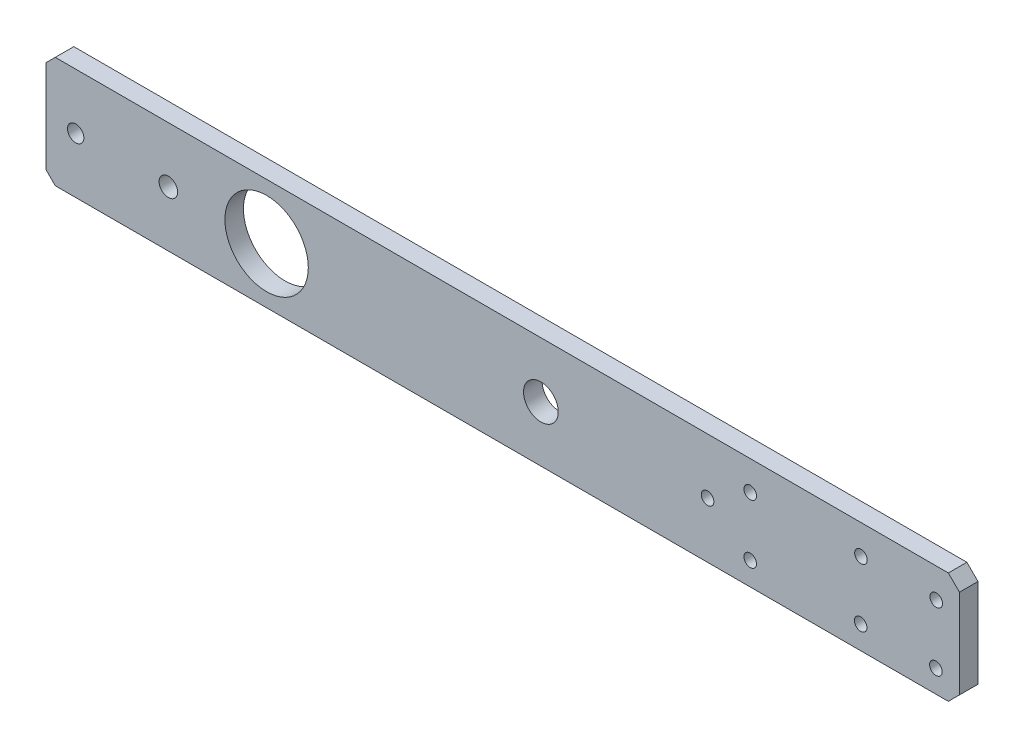
ISO-10303-21;
HEADER;
FILE_DESCRIPTION(('STEP AP214'),'2;1');
FILE_NAME('part.step','',(''),(''),'','','');
FILE_SCHEMA(('AUTOMOTIVE_DESIGN { 1 0 10303 214 1 1 1 1 }'));
ENDSEC;
DATA;
#1=APPLICATION_CONTEXT('core data for automotive mechanical design processes');
#2=APPLICATION_PROTOCOL_DEFINITION('international standard','automotive_design',2000,#1);
#3=PRODUCT_CONTEXT('',#1,'mechanical');
#4=PRODUCT('Part','Part','',(#3));
#5=PRODUCT_RELATED_PRODUCT_CATEGORY('part','',(#4));
#6=PRODUCT_DEFINITION_FORMATION('','',#4);
#7=PRODUCT_DEFINITION_CONTEXT('part definition',#1,'design');
#8=PRODUCT_DEFINITION('design','',#6,#7);
#9=PRODUCT_DEFINITION_SHAPE('','',#8);
#10=(LENGTH_UNIT() NAMED_UNIT(*) SI_UNIT(.MILLI.,.METRE.));
#11=(NAMED_UNIT(*) PLANE_ANGLE_UNIT() SI_UNIT($,.RADIAN.));
#12=(NAMED_UNIT(*) SI_UNIT($,.STERADIAN.) SOLID_ANGLE_UNIT());
#13=UNCERTAINTY_MEASURE_WITH_UNIT(LENGTH_MEASURE(1.E-05),#10,'distance_accuracy_value','');
#14=(GEOMETRIC_REPRESENTATION_CONTEXT(3) GLOBAL_UNCERTAINTY_ASSIGNED_CONTEXT((#13)) GLOBAL_UNIT_ASSIGNED_CONTEXT((#10,
#11,#12)) REPRESENTATION_CONTEXT('',''));
#15=CARTESIAN_POINT('',(0.,0.,0.));
#16=DIRECTION('',(0.,0.,1.));
#17=DIRECTION('',(1.,0.,0.));
#18=AXIS2_PLACEMENT_3D('',#15,#16,#17);
#19=CARTESIAN_POINT('',(0.,0.,3.175));
#20=DIRECTION('',(0.,0.,-1.));
#21=DIRECTION('',(-1.,0.,0.));
#22=AXIS2_PLACEMENT_3D('',#19,#20,#21);
#23=PLANE('',#22);
#24=CARTESIAN_POINT('',(0.,0.,3.175));
#25=DIRECTION('',(0.,0.,1.));
#26=DIRECTION('',(1.,0.,0.));
#27=AXIS2_PLACEMENT_3D('',#24,#25,#26);
#28=CIRCLE('',#27,14.2875);
#29=CARTESIAN_POINT('',(14.2875,0.,3.175));
#30=VERTEX_POINT('',#29);
#31=EDGE_CURVE('E112',#30,#30,#28,.T.);
#32=ORIENTED_EDGE('',*,*,#31,.F.);
#33=EDGE_LOOP('',(#32));
#34=FACE_BOUND('',#33,.T.);
#35=DIRECTION('',(0.,-1.,0.));
#36=VECTOR('',#35,1.);
#37=CARTESIAN_POINT('',(-75.5649999999997,-19.05,3.175));
#38=LINE('',#37,#36);
#39=CARTESIAN_POINT('',(-75.5649999999997,15.875,3.175));
#40=VERTEX_POINT('',#39);
#41=CARTESIAN_POINT('',(-75.5649999999997,-15.875,3.175));
#42=VERTEX_POINT('',#41);
#43=EDGE_CURVE('E190',#40,#42,#38,.T.);
#44=ORIENTED_EDGE('',*,*,#43,.T.);
#45=DIRECTION('',(0.707106781186548,-0.707106781186548,0.));
#46=VECTOR('',#45,1.);
#47=CARTESIAN_POINT('',(-75.5649999999997,-15.875,3.175));
#48=LINE('',#47,#46);
#49=CARTESIAN_POINT('',(-72.3899999999997,-19.05,3.175));
#50=VERTEX_POINT('',#49);
#51=EDGE_CURVE('E153',#42,#50,#48,.T.);
#52=ORIENTED_EDGE('',*,*,#51,.T.);
#53=DIRECTION('',(1.,0.,0.));
#54=VECTOR('',#53,1.);
#55=CARTESIAN_POINT('',(-28.5749999999997,-19.05,3.175));
#56=LINE('',#55,#54);
#57=CARTESIAN_POINT('',(233.542085197356,-19.05,3.175));
#58=VERTEX_POINT('',#57);
#59=EDGE_CURVE('E131',#50,#58,#56,.T.);
#60=ORIENTED_EDGE('',*,*,#59,.T.);
#61=DIRECTION('',(-0.707106781186548,-0.707106781186547,0.));
#62=VECTOR('',#61,1.);
#63=CARTESIAN_POINT('',(233.542085197356,-19.05,3.175));
#64=LINE('',#63,#62);
#65=CARTESIAN_POINT('',(237.352085197356,-15.24,3.175));
#66=VERTEX_POINT('',#65);
#67=EDGE_CURVE('E127',#58,#66,#64,.F.);
#68=ORIENTED_EDGE('',*,*,#67,.T.);
#69=DIRECTION('',(0.,-1.,0.));
#70=VECTOR('',#69,1.);
#71=CARTESIAN_POINT('',(237.352085197356,19.0500000000001,3.175));
#72=LINE('',#71,#70);
#73=CARTESIAN_POINT('',(237.352085197356,15.24,3.175));
#74=VERTEX_POINT('',#73);
#75=EDGE_CURVE('E200',#74,#66,#72,.T.);
#76=ORIENTED_EDGE('',*,*,#75,.F.);
#77=DIRECTION('',(0.707106781186547,-0.707106781186548,0.));
#78=VECTOR('',#77,1.);
#79=CARTESIAN_POINT('',(237.352085197356,15.24,3.175));
#80=LINE('',#79,#78);
#81=CARTESIAN_POINT('',(233.542085197356,19.0500000000001,3.175));
#82=VERTEX_POINT('',#81);
#83=EDGE_CURVE('E137',#74,#82,#80,.F.);
#84=ORIENTED_EDGE('',*,*,#83,.T.);
#85=DIRECTION('',(-1.,0.,0.));
#86=VECTOR('',#85,1.);
#87=CARTESIAN_POINT('',(0.,19.05,3.175));
#88=LINE('',#87,#86);
#89=CARTESIAN_POINT('',(-72.3899999999997,19.05,3.175));
#90=VERTEX_POINT('',#89);
#91=EDGE_CURVE('E128',#82,#90,#88,.T.);
#92=ORIENTED_EDGE('',*,*,#91,.T.);
#93=DIRECTION('',(-0.707106781186544,-0.707106781186551,0.));
#94=VECTOR('',#93,1.);
#95=CARTESIAN_POINT('',(-72.3899999999997,19.05,3.175));
#96=LINE('',#95,#94);
#97=EDGE_CURVE('E151',#90,#40,#96,.T.);
#98=ORIENTED_EDGE('',*,*,#97,.T.);
#99=EDGE_LOOP('',(#44,#52,#60,#68,#76,#84,#92,#98));
#100=FACE_BOUND('',#99,.T.);
#101=CARTESIAN_POINT('',(151.067159691472,0.,3.175));
#102=DIRECTION('',(0.,0.,1.));
#103=DIRECTION('',(1.,0.,0.));
#104=AXIS2_PLACEMENT_3D('',#101,#102,#103);
#105=CIRCLE('',#104,2.15265000000001);
#106=CARTESIAN_POINT('',(153.219809691472,0.,3.175));
#107=VERTEX_POINT('',#106);
#108=EDGE_CURVE('E235',#107,#107,#105,.T.);
#109=ORIENTED_EDGE('',*,*,#108,.F.);
#110=EDGE_LOOP('',(#109));
#111=FACE_BOUND('',#110,.T.);
#112=CARTESIAN_POINT('',(165.672159691472,-11.1439269688226,3.175));
#113=DIRECTION('',(0.,0.,1.));
#114=DIRECTION('',(1.,0.,0.));
#115=AXIS2_PLACEMENT_3D('',#112,#113,#114);
#116=CIRCLE('',#115,2.15265000000001);
#117=CARTESIAN_POINT('',(167.824809691472,-11.1439269688226,3.175));
#118=VERTEX_POINT('',#117);
#119=EDGE_CURVE('E232',#118,#118,#116,.T.);
#120=ORIENTED_EDGE('',*,*,#119,.F.);
#121=EDGE_LOOP('',(#120));
#122=FACE_BOUND('',#121,.T.);
#123=CARTESIAN_POINT('',(165.672159691472,8.99137535087546,3.175));
#124=DIRECTION('',(0.,0.,1.));
#125=DIRECTION('',(1.,0.,0.));
#126=AXIS2_PLACEMENT_3D('',#123,#124,#125);
#127=CIRCLE('',#126,2.15265000000001);
#128=CARTESIAN_POINT('',(167.824809691472,8.99137535087546,3.175));
#129=VERTEX_POINT('',#128);
#130=EDGE_CURVE('E229',#129,#129,#127,.T.);
#131=ORIENTED_EDGE('',*,*,#130,.F.);
#132=EDGE_LOOP('',(#131));
#133=FACE_BOUND('',#132,.T.);
#134=CARTESIAN_POINT('',(203.608782335042,8.99137535087546,3.175));
#135=DIRECTION('',(0.,0.,1.));
#136=DIRECTION('',(1.,0.,0.));
#137=AXIS2_PLACEMENT_3D('',#134,#135,#136);
#138=CIRCLE('',#137,2.15265000000001);
#139=CARTESIAN_POINT('',(205.761432335042,8.99137535087546,3.175));
#140=VERTEX_POINT('',#139);
#141=EDGE_CURVE('E223',#140,#140,#138,.T.);
#142=ORIENTED_EDGE('',*,*,#141,.F.);
#143=EDGE_LOOP('',(#142));
#144=FACE_BOUND('',#143,.T.);
#145=CARTESIAN_POINT('',(203.503161764145,-11.1439269688226,3.175));
#146=DIRECTION('',(0.,0.,1.));
#147=DIRECTION('',(1.,0.,0.));
#148=AXIS2_PLACEMENT_3D('',#145,#146,#147);
#149=CIRCLE('',#148,2.15265000000001);
#150=CARTESIAN_POINT('',(205.655811764145,-11.1439269688226,3.175));
#151=VERTEX_POINT('',#150);
#152=EDGE_CURVE('E217',#151,#151,#149,.T.);
#153=ORIENTED_EDGE('',*,*,#152,.F.);
#154=EDGE_LOOP('',(#153));
#155=FACE_BOUND('',#154,.T.);
#156=CARTESIAN_POINT('',(229.282371238552,-11.3467989682312,3.175));
#157=DIRECTION('',(0.,0.,1.));
#158=DIRECTION('',(1.,0.,0.));
#159=AXIS2_PLACEMENT_3D('',#156,#157,#158);
#160=CIRCLE('',#159,2.15265000000001);
#161=CARTESIAN_POINT('',(231.435021238552,-11.3467989682312,3.175));
#162=VERTEX_POINT('',#161);
#163=EDGE_CURVE('E211',#162,#162,#160,.T.);
#164=ORIENTED_EDGE('',*,*,#163,.F.);
#165=EDGE_LOOP('',(#164));
#166=FACE_BOUND('',#165,.T.);
#167=CARTESIAN_POINT('',(229.388701470581,8.92379178362501,3.175));
#168=DIRECTION('',(0.,0.,1.));
#169=DIRECTION('',(1.,0.,0.));
#170=AXIS2_PLACEMENT_3D('',#167,#168,#169);
#171=CIRCLE('',#170,2.15265000000001);
#172=CARTESIAN_POINT('',(231.541351470581,8.92379178362501,3.175));
#173=VERTEX_POINT('',#172);
#174=EDGE_CURVE('E203',#173,#173,#171,.T.);
#175=ORIENTED_EDGE('',*,*,#174,.F.);
#176=EDGE_LOOP('',(#175));
#177=FACE_BOUND('',#176,.T.);
#178=CARTESIAN_POINT('',(-33.6549999999997,0.,3.175));
#179=DIRECTION('',(0.,0.,1.));
#180=DIRECTION('',(1.,0.,0.));
#181=AXIS2_PLACEMENT_3D('',#178,#179,#180);
#182=CIRCLE('',#181,3.175);
#183=CARTESIAN_POINT('',(-30.4799999999997,0.,3.175));
#184=VERTEX_POINT('',#183);
#185=EDGE_CURVE('E195',#184,#184,#182,.T.);
#186=ORIENTED_EDGE('',*,*,#185,.F.);
#187=EDGE_LOOP('',(#186));
#188=FACE_BOUND('',#187,.T.);
#189=CARTESIAN_POINT('',(93.9672182120003,0.,3.175));
#190=DIRECTION('',(0.,0.,-1.));
#191=DIRECTION('',(-1.,0.,0.));
#192=AXIS2_PLACEMENT_3D('',#189,#190,#191);
#193=CIRCLE('',#192,5.953125);
#194=CARTESIAN_POINT('',(88.0140932120003,0.,3.175));
#195=VERTEX_POINT('',#194);
#196=EDGE_CURVE('E455',#195,#195,#193,.T.);
#197=ORIENTED_EDGE('',*,*,#196,.T.);
#198=EDGE_LOOP('',(#197));
#199=FACE_BOUND('',#198,.T.);
#200=CARTESIAN_POINT('',(-65.4049999999997,0.,3.175));
#201=DIRECTION('',(0.,0.,-1.));
#202=DIRECTION('',(-1.,0.,0.));
#203=AXIS2_PLACEMENT_3D('',#200,#201,#202);
#204=CIRCLE('',#203,2.80669999999999);
#205=CARTESIAN_POINT('',(-68.2116999999997,0.,3.175));
#206=VERTEX_POINT('',#205);
#207=EDGE_CURVE('E12',#206,#206,#204,.T.);
#208=ORIENTED_EDGE('',*,*,#207,.T.);
#209=EDGE_LOOP('',(#208));
#210=FACE_BOUND('',#209,.T.);
#211=ADVANCED_FACE('F39',(#34,#100,#111,#122,#133,#144,#155,#166,#177,#188,#199,#210),#23,.F.);
#212=CARTESIAN_POINT('',(0.,0.,-3.175));
#213=DIRECTION('',(0.,0.,-1.));
#214=DIRECTION('',(-1.,0.,0.));
#215=AXIS2_PLACEMENT_3D('',#212,#213,#214);
#216=PLANE('',#215);
#217=CARTESIAN_POINT('',(165.672159691472,-11.1439269688226,-3.175));
#218=DIRECTION('',(0.,0.,-1.));
#219=DIRECTION('',(-1.,0.,0.));
#220=AXIS2_PLACEMENT_3D('',#217,#218,#219);
#221=CIRCLE('',#220,2.15265000000001);
#222=CARTESIAN_POINT('',(163.519509691472,-11.1439269688226,-3.175));
#223=VERTEX_POINT('',#222);
#224=EDGE_CURVE('E47',#223,#223,#221,.T.);
#225=ORIENTED_EDGE('',*,*,#224,.F.);
#226=EDGE_LOOP('',(#225));
#227=FACE_BOUND('',#226,.T.);
#228=CARTESIAN_POINT('',(165.672159691472,8.99137535087546,-3.175));
#229=DIRECTION('',(0.,0.,-1.));
#230=DIRECTION('',(-1.,0.,0.));
#231=AXIS2_PLACEMENT_3D('',#228,#229,#230);
#232=CIRCLE('',#231,2.15265000000001);
#233=CARTESIAN_POINT('',(163.519509691472,8.99137535087546,-3.175));
#234=VERTEX_POINT('',#233);
#235=EDGE_CURVE('E165',#234,#234,#232,.T.);
#236=ORIENTED_EDGE('',*,*,#235,.F.);
#237=EDGE_LOOP('',(#236));
#238=FACE_BOUND('',#237,.T.);
#239=CARTESIAN_POINT('',(151.067159691472,0.,-3.175));
#240=DIRECTION('',(0.,0.,-1.));
#241=DIRECTION('',(-1.,0.,0.));
#242=AXIS2_PLACEMENT_3D('',#239,#240,#241);
#243=CIRCLE('',#242,2.15265000000001);
#244=CARTESIAN_POINT('',(148.914509691472,0.,-3.175));
#245=VERTEX_POINT('',#244);
#246=EDGE_CURVE('E162',#245,#245,#243,.T.);
#247=ORIENTED_EDGE('',*,*,#246,.F.);
#248=EDGE_LOOP('',(#247));
#249=FACE_BOUND('',#248,.T.);
#250=CARTESIAN_POINT('',(93.9672182120003,0.,-3.175));
#251=DIRECTION('',(0.,0.,-1.));
#252=DIRECTION('',(-1.,0.,0.));
#253=AXIS2_PLACEMENT_3D('',#250,#251,#252);
#254=CIRCLE('',#253,5.95312499999999);
#255=CARTESIAN_POINT('',(88.0140932120003,0.,-3.175));
#256=VERTEX_POINT('',#255);
#257=EDGE_CURVE('E181',#256,#256,#254,.T.);
#258=ORIENTED_EDGE('',*,*,#257,.F.);
#259=EDGE_LOOP('',(#258));
#260=FACE_BOUND('',#259,.T.);
#261=CARTESIAN_POINT('',(-33.6549999999997,0.,-3.175));
#262=DIRECTION('',(0.,0.,1.));
#263=DIRECTION('',(1.,0.,0.));
#264=AXIS2_PLACEMENT_3D('',#261,#262,#263);
#265=CIRCLE('',#264,3.175);
#266=CARTESIAN_POINT('',(-30.4799999999997,0.,-3.175));
#267=VERTEX_POINT('',#266);
#268=EDGE_CURVE('E185',#267,#267,#265,.T.);
#269=ORIENTED_EDGE('',*,*,#268,.T.);
#270=EDGE_LOOP('',(#269));
#271=FACE_BOUND('',#270,.T.);
#272=CARTESIAN_POINT('',(-65.4049999999997,0.,-3.175));
#273=DIRECTION('',(0.,0.,1.));
#274=DIRECTION('',(1.,0.,0.));
#275=AXIS2_PLACEMENT_3D('',#272,#273,#274);
#276=CIRCLE('',#275,2.8067);
#277=CARTESIAN_POINT('',(-62.5982999999997,0.,-3.175));
#278=VERTEX_POINT('',#277);
#279=EDGE_CURVE('E188',#278,#278,#276,.T.);
#280=ORIENTED_EDGE('',*,*,#279,.T.);
#281=EDGE_LOOP('',(#280));
#282=FACE_BOUND('',#281,.T.);
#283=DIRECTION('',(1.,0.,0.));
#284=VECTOR('',#283,1.);
#285=CARTESIAN_POINT('',(0.,-19.05,-3.175));
#286=LINE('',#285,#284);
#287=CARTESIAN_POINT('',(-72.3899999999997,-19.05,-3.175));
#288=VERTEX_POINT('',#287);
#289=CARTESIAN_POINT('',(233.542085197356,-19.05,-3.175));
#290=VERTEX_POINT('',#289);
#291=EDGE_CURVE('E105',#288,#290,#286,.T.);
#292=ORIENTED_EDGE('',*,*,#291,.F.);
#293=DIRECTION('',(-0.707106781186548,0.707106781186548,0.));
#294=VECTOR('',#293,1.);
#295=CARTESIAN_POINT('',(-45.7199999999998,-45.7199999999998,-3.175));
#296=LINE('',#295,#294);
#297=CARTESIAN_POINT('',(-75.5649999999997,-15.875,-3.175));
#298=VERTEX_POINT('',#297);
#299=EDGE_CURVE('E157',#288,#298,#296,.T.);
#300=ORIENTED_EDGE('',*,*,#299,.T.);
#301=DIRECTION('',(0.,-1.,0.));
#302=VECTOR('',#301,1.);
#303=CARTESIAN_POINT('',(-75.5649999999997,-19.05,-3.175));
#304=LINE('',#303,#302);
#305=CARTESIAN_POINT('',(-75.5649999999997,15.875,-3.175));
#306=VERTEX_POINT('',#305);
#307=EDGE_CURVE('E193',#306,#298,#304,.T.);
#308=ORIENTED_EDGE('',*,*,#307,.F.);
#309=DIRECTION('',(0.707106781186544,0.707106781186551,0.));
#310=VECTOR('',#309,1.);
#311=CARTESIAN_POINT('',(-45.7200000000001,45.7199999999997,-3.175));
#312=LINE('',#311,#310);
#313=CARTESIAN_POINT('',(-72.3899999999997,19.05,-3.175));
#314=VERTEX_POINT('',#313);
#315=EDGE_CURVE('E54',#306,#314,#312,.T.);
#316=ORIENTED_EDGE('',*,*,#315,.T.);
#317=DIRECTION('',(-1.,0.,0.));
#318=VECTOR('',#317,1.);
#319=CARTESIAN_POINT('',(0.,19.05,-3.175));
#320=LINE('',#319,#318);
#321=CARTESIAN_POINT('',(233.542085197356,19.0500000000001,-3.175));
#322=VERTEX_POINT('',#321);
#323=EDGE_CURVE('E111',#322,#314,#320,.T.);
#324=ORIENTED_EDGE('',*,*,#323,.F.);
#325=DIRECTION('',(-0.707106781186547,0.707106781186548,0.));
#326=VECTOR('',#325,1.);
#327=CARTESIAN_POINT('',(126.296042598678,126.296042598678,-3.175));
#328=LINE('',#327,#326);
#329=CARTESIAN_POINT('',(237.352085197356,15.24,-3.175));
#330=VERTEX_POINT('',#329);
#331=EDGE_CURVE('E123',#322,#330,#328,.F.);
#332=ORIENTED_EDGE('',*,*,#331,.T.);
#333=DIRECTION('',(0.,-1.,0.));
#334=VECTOR('',#333,1.);
#335=CARTESIAN_POINT('',(237.352085197356,19.0500000000001,-3.175));
#336=LINE('',#335,#334);
#337=CARTESIAN_POINT('',(237.352085197356,-15.24,-3.175));
#338=VERTEX_POINT('',#337);
#339=EDGE_CURVE('E120',#330,#338,#336,.T.);
#340=ORIENTED_EDGE('',*,*,#339,.T.);
#341=DIRECTION('',(0.707106781186548,0.707106781186547,0.));
#342=VECTOR('',#341,1.);
#343=CARTESIAN_POINT('',(126.296042598678,-126.296042598678,-3.175));
#344=LINE('',#343,#342);
#345=EDGE_CURVE('E116',#338,#290,#344,.F.);
#346=ORIENTED_EDGE('',*,*,#345,.T.);
#347=EDGE_LOOP('',(#292,#300,#308,#316,#324,#332,#340,#346));
#348=FACE_BOUND('',#347,.T.);
#349=CARTESIAN_POINT('',(229.388701470581,8.92379178362501,-3.175));
#350=DIRECTION('',(0.,0.,1.));
#351=DIRECTION('',(1.,0.,0.));
#352=AXIS2_PLACEMENT_3D('',#349,#350,#351);
#353=CIRCLE('',#352,2.15265000000001);
#354=CARTESIAN_POINT('',(231.541351470581,8.92379178362501,-3.175));
#355=VERTEX_POINT('',#354);
#356=EDGE_CURVE('E208',#355,#355,#353,.T.);
#357=ORIENTED_EDGE('',*,*,#356,.T.);
#358=EDGE_LOOP('',(#357));
#359=FACE_BOUND('',#358,.T.);
#360=CARTESIAN_POINT('',(229.282371238552,-11.3467989682312,-3.175));
#361=DIRECTION('',(0.,0.,1.));
#362=DIRECTION('',(1.,0.,0.));
#363=AXIS2_PLACEMENT_3D('',#360,#361,#362);
#364=CIRCLE('',#363,2.15265000000001);
#365=CARTESIAN_POINT('',(231.435021238552,-11.3467989682312,-3.175));
#366=VERTEX_POINT('',#365);
#367=EDGE_CURVE('E214',#366,#366,#364,.T.);
#368=ORIENTED_EDGE('',*,*,#367,.T.);
#369=EDGE_LOOP('',(#368));
#370=FACE_BOUND('',#369,.T.);
#371=CARTESIAN_POINT('',(203.503161764145,-11.1439269688226,-3.175));
#372=DIRECTION('',(0.,0.,1.));
#373=DIRECTION('',(1.,0.,0.));
#374=AXIS2_PLACEMENT_3D('',#371,#372,#373);
#375=CIRCLE('',#374,2.15265000000001);
#376=CARTESIAN_POINT('',(205.655811764145,-11.1439269688226,-3.175));
#377=VERTEX_POINT('',#376);
#378=EDGE_CURVE('E220',#377,#377,#375,.T.);
#379=ORIENTED_EDGE('',*,*,#378,.T.);
#380=EDGE_LOOP('',(#379));
#381=FACE_BOUND('',#380,.T.);
#382=CARTESIAN_POINT('',(203.608782335042,8.99137535087546,-3.175));
#383=DIRECTION('',(0.,0.,1.));
#384=DIRECTION('',(1.,0.,0.));
#385=AXIS2_PLACEMENT_3D('',#382,#383,#384);
#386=CIRCLE('',#385,2.15265000000001);
#387=CARTESIAN_POINT('',(205.761432335042,8.99137535087546,-3.175));
#388=VERTEX_POINT('',#387);
#389=EDGE_CURVE('E226',#388,#388,#386,.T.);
#390=ORIENTED_EDGE('',*,*,#389,.T.);
#391=EDGE_LOOP('',(#390));
#392=FACE_BOUND('',#391,.T.);
#393=CARTESIAN_POINT('',(0.,0.,-3.175));
#394=DIRECTION('',(0.,0.,1.));
#395=DIRECTION('',(1.,0.,0.));
#396=AXIS2_PLACEMENT_3D('',#393,#394,#395);
#397=CIRCLE('',#396,14.2875);
#398=CARTESIAN_POINT('',(14.2875,0.,-3.175));
#399=VERTEX_POINT('',#398);
#400=EDGE_CURVE('E238',#399,#399,#397,.T.);
#401=ORIENTED_EDGE('',*,*,#400,.T.);
#402=EDGE_LOOP('',(#401));
#403=FACE_BOUND('',#402,.T.);
#404=ADVANCED_FACE('F117',(#227,#238,#249,#260,#271,#282,#348,#359,#370,#381,#392,#403),#216,.T.);
#405=CARTESIAN_POINT('',(0.,-19.05,3.175));
#406=DIRECTION('',(0.,1.,0.));
#407=DIRECTION('',(0.,0.,1.));
#408=AXIS2_PLACEMENT_3D('',#405,#406,#407);
#409=PLANE('',#408);
#410=ORIENTED_EDGE('',*,*,#59,.F.);
#411=DIRECTION('',(0.,0.,-1.));
#412=VECTOR('',#411,1.);
#413=CARTESIAN_POINT('',(-72.3899999999997,-19.05,-3.175));
#414=LINE('',#413,#412);
#415=EDGE_CURVE('E62',#50,#288,#414,.T.);
#416=ORIENTED_EDGE('',*,*,#415,.T.);
#417=ORIENTED_EDGE('',*,*,#291,.T.);
#418=DIRECTION('',(0.,0.,1.));
#419=VECTOR('',#418,1.);
#420=CARTESIAN_POINT('',(233.542085197356,-19.05,3.175));
#421=LINE('',#420,#419);
#422=EDGE_CURVE('E109',#290,#58,#421,.T.);
#423=ORIENTED_EDGE('',*,*,#422,.T.);
#424=EDGE_LOOP('',(#410,#416,#417,#423));
#425=FACE_BOUND('',#424,.T.);
#426=ADVANCED_FACE('F107',(#425),#409,.F.);
#427=CARTESIAN_POINT('',(0.,19.05,3.175));
#428=DIRECTION('',(0.,-1.,0.));
#429=DIRECTION('',(1.,0.,0.));
#430=AXIS2_PLACEMENT_3D('',#427,#428,#429);
#431=PLANE('',#430);
#432=ORIENTED_EDGE('',*,*,#323,.T.);
#433=DIRECTION('',(0.,0.,1.));
#434=VECTOR('',#433,1.);
#435=CARTESIAN_POINT('',(-72.3899999999997,19.05,3.175));
#436=LINE('',#435,#434);
#437=EDGE_CURVE('E159',#314,#90,#436,.T.);
#438=ORIENTED_EDGE('',*,*,#437,.T.);
#439=ORIENTED_EDGE('',*,*,#91,.F.);
#440=DIRECTION('',(0.,0.,-1.));
#441=VECTOR('',#440,1.);
#442=CARTESIAN_POINT('',(233.542085197356,19.0500000000001,3.175));
#443=LINE('',#442,#441);
#444=EDGE_CURVE('E139',#82,#322,#443,.T.);
#445=ORIENTED_EDGE('',*,*,#444,.T.);
#446=EDGE_LOOP('',(#432,#438,#439,#445));
#447=FACE_BOUND('',#446,.T.);
#448=ADVANCED_FACE('F246',(#447),#431,.F.);
#449=CARTESIAN_POINT('',(0.,0.,3.175));
#450=DIRECTION('',(0.,0.,-1.));
#451=DIRECTION('',(-1.,0.,0.));
#452=AXIS2_PLACEMENT_3D('',#449,#450,#451);
#453=CYLINDRICAL_SURFACE('',#452,14.2875);
#454=ORIENTED_EDGE('',*,*,#31,.T.);
#455=EDGE_LOOP('',(#454));
#456=FACE_BOUND('',#455,.T.);
#457=ORIENTED_EDGE('',*,*,#400,.F.);
#458=EDGE_LOOP('',(#457));
#459=FACE_BOUND('',#458,.T.);
#460=ADVANCED_FACE('F277',(#456,#459),#453,.F.);
#461=CARTESIAN_POINT('',(151.067159691472,0.,3.175));
#462=DIRECTION('',(0.,0.,1.));
#463=DIRECTION('',(1.,0.,0.));
#464=AXIS2_PLACEMENT_3D('',#461,#462,#463);
#465=CYLINDRICAL_SURFACE('',#464,2.15265000000001);
#466=ORIENTED_EDGE('',*,*,#108,.T.);
#467=EDGE_LOOP('',(#466));
#468=FACE_BOUND('',#467,.T.);
#469=ORIENTED_EDGE('',*,*,#246,.T.);
#470=EDGE_LOOP('',(#469));
#471=FACE_BOUND('',#470,.T.);
#472=ADVANCED_FACE('F352',(#468,#471),#465,.F.);
#473=CARTESIAN_POINT('',(165.672159691472,-11.1439269688226,3.175));
#474=DIRECTION('',(0.,0.,1.));
#475=DIRECTION('',(1.,0.,0.));
#476=AXIS2_PLACEMENT_3D('',#473,#474,#475);
#477=CYLINDRICAL_SURFACE('',#476,2.15265000000001);
#478=ORIENTED_EDGE('',*,*,#119,.T.);
#479=EDGE_LOOP('',(#478));
#480=FACE_BOUND('',#479,.T.);
#481=ORIENTED_EDGE('',*,*,#224,.T.);
#482=EDGE_LOOP('',(#481));
#483=FACE_BOUND('',#482,.T.);
#484=ADVANCED_FACE('F41',(#480,#483),#477,.F.);
#485=CARTESIAN_POINT('',(165.672159691472,8.99137535087546,3.175));
#486=DIRECTION('',(0.,0.,1.));
#487=DIRECTION('',(1.,0.,0.));
#488=AXIS2_PLACEMENT_3D('',#485,#486,#487);
#489=CYLINDRICAL_SURFACE('',#488,2.15265000000001);
#490=ORIENTED_EDGE('',*,*,#130,.T.);
#491=EDGE_LOOP('',(#490));
#492=FACE_BOUND('',#491,.T.);
#493=ORIENTED_EDGE('',*,*,#235,.T.);
#494=EDGE_LOOP('',(#493));
#495=FACE_BOUND('',#494,.T.);
#496=ADVANCED_FACE('F368',(#492,#495),#489,.F.);
#497=CARTESIAN_POINT('',(203.608782335042,8.99137535087546,3.175));
#498=DIRECTION('',(0.,0.,1.));
#499=DIRECTION('',(1.,0.,0.));
#500=AXIS2_PLACEMENT_3D('',#497,#498,#499);
#501=CYLINDRICAL_SURFACE('',#500,2.15265000000001);
#502=ORIENTED_EDGE('',*,*,#389,.F.);
#503=EDGE_LOOP('',(#502));
#504=FACE_BOUND('',#503,.T.);
#505=ORIENTED_EDGE('',*,*,#141,.T.);
#506=EDGE_LOOP('',(#505));
#507=FACE_BOUND('',#506,.T.);
#508=ADVANCED_FACE('F377',(#504,#507),#501,.F.);
#509=CARTESIAN_POINT('',(203.503161764145,-11.1439269688226,3.175));
#510=DIRECTION('',(0.,0.,1.));
#511=DIRECTION('',(1.,0.,0.));
#512=AXIS2_PLACEMENT_3D('',#509,#510,#511);
#513=CYLINDRICAL_SURFACE('',#512,2.15265000000001);
#514=ORIENTED_EDGE('',*,*,#378,.F.);
#515=EDGE_LOOP('',(#514));
#516=FACE_BOUND('',#515,.T.);
#517=ORIENTED_EDGE('',*,*,#152,.T.);
#518=EDGE_LOOP('',(#517));
#519=FACE_BOUND('',#518,.T.);
#520=ADVANCED_FACE('F395',(#516,#519),#513,.F.);
#521=CARTESIAN_POINT('',(229.282371238552,-11.3467989682312,3.175));
#522=DIRECTION('',(0.,0.,1.));
#523=DIRECTION('',(1.,0.,0.));
#524=AXIS2_PLACEMENT_3D('',#521,#522,#523);
#525=CYLINDRICAL_SURFACE('',#524,2.15265000000001);
#526=ORIENTED_EDGE('',*,*,#367,.F.);
#527=EDGE_LOOP('',(#526));
#528=FACE_BOUND('',#527,.T.);
#529=ORIENTED_EDGE('',*,*,#163,.T.);
#530=EDGE_LOOP('',(#529));
#531=FACE_BOUND('',#530,.T.);
#532=ADVANCED_FACE('F402',(#528,#531),#525,.F.);
#533=CARTESIAN_POINT('',(229.388701470581,8.92379178362501,3.175));
#534=DIRECTION('',(0.,0.,1.));
#535=DIRECTION('',(1.,0.,0.));
#536=AXIS2_PLACEMENT_3D('',#533,#534,#535);
#537=CYLINDRICAL_SURFACE('',#536,2.15265000000001);
#538=ORIENTED_EDGE('',*,*,#356,.F.);
#539=EDGE_LOOP('',(#538));
#540=FACE_BOUND('',#539,.T.);
#541=ORIENTED_EDGE('',*,*,#174,.T.);
#542=EDGE_LOOP('',(#541));
#543=FACE_BOUND('',#542,.T.);
#544=ADVANCED_FACE('F410',(#540,#543),#537,.F.);
#545=CARTESIAN_POINT('',(237.352085197356,19.0500000000001,-3.175));
#546=DIRECTION('',(-1.,0.,0.));
#547=DIRECTION('',(0.,-1.,0.));
#548=AXIS2_PLACEMENT_3D('',#545,#546,#547);
#549=PLANE('',#548);
#550=ORIENTED_EDGE('',*,*,#339,.F.);
#551=DIRECTION('',(0.,0.,1.));
#552=VECTOR('',#551,1.);
#553=CARTESIAN_POINT('',(237.352085197356,15.24,-3.175));
#554=LINE('',#553,#552);
#555=EDGE_CURVE('E143',#330,#74,#554,.T.);
#556=ORIENTED_EDGE('',*,*,#555,.T.);
#557=ORIENTED_EDGE('',*,*,#75,.T.);
#558=DIRECTION('',(0.,0.,-1.));
#559=VECTOR('',#558,1.);
#560=CARTESIAN_POINT('',(237.352085197356,-15.24,-3.175));
#561=LINE('',#560,#559);
#562=EDGE_CURVE('E141',#66,#338,#561,.T.);
#563=ORIENTED_EDGE('',*,*,#562,.T.);
#564=EDGE_LOOP('',(#550,#556,#557,#563));
#565=FACE_BOUND('',#564,.T.);
#566=ADVANCED_FACE('F286',(#565),#549,.F.);
#567=CARTESIAN_POINT('',(237.352085197356,15.24,-3.175));
#568=DIRECTION('',(-0.707106781186548,-0.707106781186547,0.));
#569=DIRECTION('',(0.,0.,1.));
#570=AXIS2_PLACEMENT_3D('',#567,#568,#569);
#571=PLANE('',#570);
#572=ORIENTED_EDGE('',*,*,#331,.F.);
#573=ORIENTED_EDGE('',*,*,#444,.F.);
#574=ORIENTED_EDGE('',*,*,#83,.F.);
#575=ORIENTED_EDGE('',*,*,#555,.F.);
#576=EDGE_LOOP('',(#572,#573,#574,#575));
#577=FACE_BOUND('',#576,.T.);
#578=ADVANCED_FACE('F284',(#577),#571,.F.);
#579=CARTESIAN_POINT('',(233.542085197356,-19.05,3.175));
#580=DIRECTION('',(-0.707106781186547,0.707106781186548,0.));
#581=DIRECTION('',(0.,0.,1.));
#582=AXIS2_PLACEMENT_3D('',#579,#580,#581);
#583=PLANE('',#582);
#584=ORIENTED_EDGE('',*,*,#345,.F.);
#585=ORIENTED_EDGE('',*,*,#562,.F.);
#586=ORIENTED_EDGE('',*,*,#67,.F.);
#587=ORIENTED_EDGE('',*,*,#422,.F.);
#588=EDGE_LOOP('',(#584,#585,#586,#587));
#589=FACE_BOUND('',#588,.T.);
#590=ADVANCED_FACE('F126',(#589),#583,.F.);
#591=CARTESIAN_POINT('',(-75.5649999999997,-19.05,-3.175));
#592=DIRECTION('',(-1.,0.,0.));
#593=DIRECTION('',(0.,0.,1.));
#594=AXIS2_PLACEMENT_3D('',#591,#592,#593);
#595=PLANE('',#594);
#596=ORIENTED_EDGE('',*,*,#307,.T.);
#597=DIRECTION('',(0.,0.,1.));
#598=VECTOR('',#597,1.);
#599=CARTESIAN_POINT('',(-75.5649999999997,-15.875,3.175));
#600=LINE('',#599,#598);
#601=EDGE_CURVE('E148',#298,#42,#600,.T.);
#602=ORIENTED_EDGE('',*,*,#601,.T.);
#603=ORIENTED_EDGE('',*,*,#43,.F.);
#604=DIRECTION('',(0.,0.,-1.));
#605=VECTOR('',#604,1.);
#606=CARTESIAN_POINT('',(-75.5649999999997,15.875,-3.175));
#607=LINE('',#606,#605);
#608=EDGE_CURVE('E146',#40,#306,#607,.T.);
#609=ORIENTED_EDGE('',*,*,#608,.T.);
#610=EDGE_LOOP('',(#596,#602,#603,#609));
#611=FACE_BOUND('',#610,.T.);
#612=ADVANCED_FACE('F256',(#611),#595,.T.);
#613=CARTESIAN_POINT('',(-75.5649999999997,-15.875,-3.175));
#614=DIRECTION('',(-0.707106781186548,-0.707106781186548,0.));
#615=DIRECTION('',(0.,0.,-1.));
#616=AXIS2_PLACEMENT_3D('',#613,#614,#615);
#617=PLANE('',#616);
#618=ORIENTED_EDGE('',*,*,#299,.F.);
#619=ORIENTED_EDGE('',*,*,#415,.F.);
#620=ORIENTED_EDGE('',*,*,#51,.F.);
#621=ORIENTED_EDGE('',*,*,#601,.F.);
#622=EDGE_LOOP('',(#618,#619,#620,#621));
#623=FACE_BOUND('',#622,.T.);
#624=ADVANCED_FACE('F259',(#623),#617,.T.);
#625=CARTESIAN_POINT('',(-72.3899999999997,19.05,3.175));
#626=DIRECTION('',(-0.707106781186551,0.707106781186544,0.));
#627=DIRECTION('',(0.,0.,-1.));
#628=AXIS2_PLACEMENT_3D('',#625,#626,#627);
#629=PLANE('',#628);
#630=ORIENTED_EDGE('',*,*,#315,.F.);
#631=ORIENTED_EDGE('',*,*,#608,.F.);
#632=ORIENTED_EDGE('',*,*,#97,.F.);
#633=ORIENTED_EDGE('',*,*,#437,.F.);
#634=EDGE_LOOP('',(#630,#631,#632,#633));
#635=FACE_BOUND('',#634,.T.);
#636=ADVANCED_FACE('F251',(#635),#629,.T.);
#637=CARTESIAN_POINT('',(-65.4049999999997,0.,3.175));
#638=DIRECTION('',(0.,0.,1.));
#639=DIRECTION('',(1.,0.,0.));
#640=AXIS2_PLACEMENT_3D('',#637,#638,#639);
#641=CYLINDRICAL_SURFACE('',#640,2.80669999999999);
#642=ORIENTED_EDGE('',*,*,#279,.F.);
#643=EDGE_LOOP('',(#642));
#644=FACE_BOUND('',#643,.T.);
#645=ORIENTED_EDGE('',*,*,#207,.F.);
#646=EDGE_LOOP('',(#645));
#647=FACE_BOUND('',#646,.T.);
#648=ADVANCED_FACE('F266',(#644,#647),#641,.F.);
#649=CARTESIAN_POINT('',(-33.6549999999997,0.,3.175));
#650=DIRECTION('',(0.,0.,1.));
#651=DIRECTION('',(1.,0.,0.));
#652=AXIS2_PLACEMENT_3D('',#649,#650,#651);
#653=CYLINDRICAL_SURFACE('',#652,3.175);
#654=ORIENTED_EDGE('',*,*,#268,.F.);
#655=EDGE_LOOP('',(#654));
#656=FACE_BOUND('',#655,.T.);
#657=ORIENTED_EDGE('',*,*,#185,.T.);
#658=EDGE_LOOP('',(#657));
#659=FACE_BOUND('',#658,.T.);
#660=ADVANCED_FACE('F319',(#656,#659),#653,.F.);
#661=CARTESIAN_POINT('',(93.9672182120003,0.,-3.175));
#662=DIRECTION('',(0.,0.,-1.));
#663=DIRECTION('',(-1.,0.,0.));
#664=AXIS2_PLACEMENT_3D('',#661,#662,#663);
#665=CYLINDRICAL_SURFACE('',#664,5.953125);
#666=ORIENTED_EDGE('',*,*,#196,.F.);
#667=EDGE_LOOP('',(#666));
#668=FACE_BOUND('',#667,.T.);
#669=ORIENTED_EDGE('',*,*,#257,.T.);
#670=EDGE_LOOP('',(#669));
#671=FACE_BOUND('',#670,.T.);
#672=ADVANCED_FACE('F324',(#668,#671),#665,.F.);
#673=CLOSED_SHELL('',(#211,#404,#426,#448,#460,#472,#484,#496,#508,#520,#532,#544,#566,#578,
#590,#612,#624,#636,#648,#660,#672));
#674=MANIFOLD_SOLID_BREP('B2',#673);
#675=ADVANCED_BREP_SHAPE_REPRESENTATION('',(#18,#674),#14);
#676=SHAPE_DEFINITION_REPRESENTATION(#9,#675);
ENDSEC;
END-ISO-10303-21;
